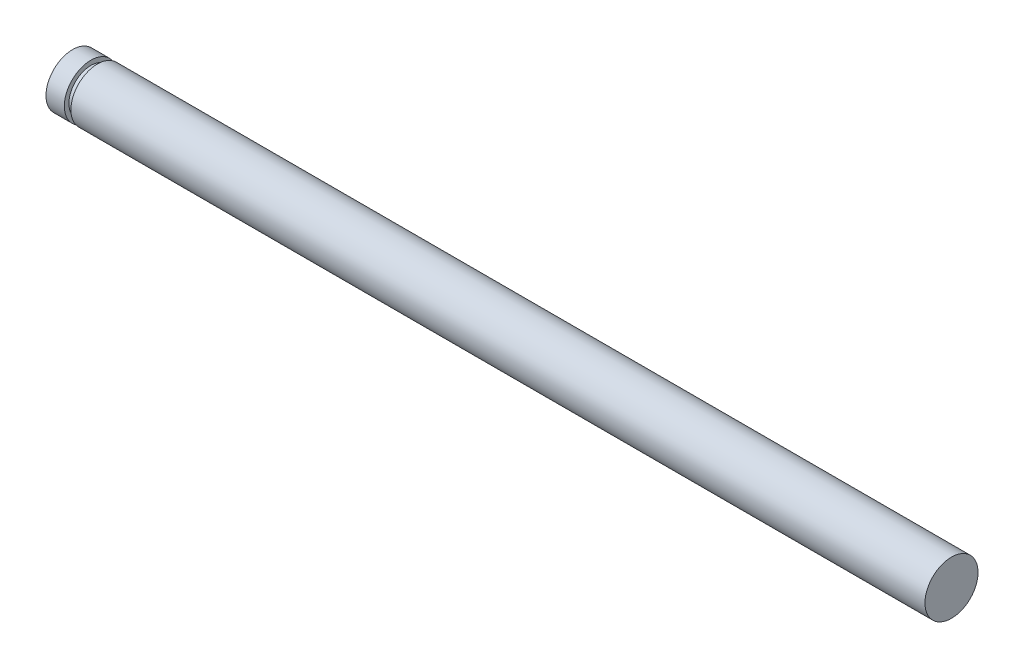
ISO-10303-21;
HEADER;
FILE_DESCRIPTION(('STEP AP214'),'2;1');
FILE_NAME('part.step','',(''),(''),'','','');
FILE_SCHEMA(('AUTOMOTIVE_DESIGN { 1 0 10303 214 1 1 1 1 }'));
ENDSEC;
DATA;
#1=APPLICATION_CONTEXT('core data for automotive mechanical design processes');
#2=APPLICATION_PROTOCOL_DEFINITION('international standard','automotive_design',2000,#1);
#3=PRODUCT_CONTEXT('',#1,'mechanical');
#4=PRODUCT('Part','Part','',(#3));
#5=PRODUCT_RELATED_PRODUCT_CATEGORY('part','',(#4));
#6=PRODUCT_DEFINITION_FORMATION('','',#4);
#7=PRODUCT_DEFINITION_CONTEXT('part definition',#1,'design');
#8=PRODUCT_DEFINITION('design','',#6,#7);
#9=PRODUCT_DEFINITION_SHAPE('','',#8);
#10=(LENGTH_UNIT() NAMED_UNIT(*) SI_UNIT(.MILLI.,.METRE.));
#11=(NAMED_UNIT(*) PLANE_ANGLE_UNIT() SI_UNIT($,.RADIAN.));
#12=(NAMED_UNIT(*) SI_UNIT($,.STERADIAN.) SOLID_ANGLE_UNIT());
#13=UNCERTAINTY_MEASURE_WITH_UNIT(LENGTH_MEASURE(1.E-05),#10,'distance_accuracy_value','');
#14=(GEOMETRIC_REPRESENTATION_CONTEXT(3) GLOBAL_UNCERTAINTY_ASSIGNED_CONTEXT((#13)) GLOBAL_UNIT_ASSIGNED_CONTEXT((#10,
#11,#12)) REPRESENTATION_CONTEXT('',''));
#15=CARTESIAN_POINT('',(0.,0.,0.));
#16=DIRECTION('',(0.,0.,1.));
#17=DIRECTION('',(1.,0.,0.));
#18=AXIS2_PLACEMENT_3D('',#15,#16,#17);
#19=CARTESIAN_POINT('',(-304.8,0.,0.));
#20=DIRECTION('',(1.,0.,0.));
#21=DIRECTION('',(0.,0.,-1.));
#22=AXIS2_PLACEMENT_3D('',#19,#20,#21);
#23=PLANE('',#22);
#24=CARTESIAN_POINT('',(-304.8,0.,0.));
#25=DIRECTION('',(-1.,0.,0.));
#26=DIRECTION('',(0.,0.,1.));
#27=AXIS2_PLACEMENT_3D('',#24,#25,#26);
#28=CIRCLE('',#27,18.415);
#29=CARTESIAN_POINT('',(-304.8,0.,18.415));
#30=VERTEX_POINT('',#29);
#31=EDGE_CURVE('E10',#30,#30,#28,.T.);
#32=ORIENTED_EDGE('',*,*,#31,.T.);
#33=EDGE_LOOP('',(#32));
#34=FACE_BOUND('',#33,.T.);
#35=ADVANCED_FACE('F35',(#34),#23,.F.);
#36=CARTESIAN_POINT('',(-304.8,0.,0.));
#37=DIRECTION('',(-1.,0.,0.));
#38=DIRECTION('',(0.,0.,1.));
#39=AXIS2_PLACEMENT_3D('',#36,#37,#38);
#40=CYLINDRICAL_SURFACE('',#39,18.415);
#41=ORIENTED_EDGE('',*,*,#31,.F.);
#42=EDGE_LOOP('',(#41));
#43=FACE_BOUND('',#42,.T.);
#44=CARTESIAN_POINT('',(-292.1,0.,0.));
#45=DIRECTION('',(-1.,0.,0.));
#46=DIRECTION('',(0.,0.,1.));
#47=AXIS2_PLACEMENT_3D('',#44,#45,#46);
#48=CIRCLE('',#47,18.415);
#49=CARTESIAN_POINT('',(-292.1,0.,18.415));
#50=VERTEX_POINT('',#49);
#51=EDGE_CURVE('E41',#50,#50,#48,.T.);
#52=ORIENTED_EDGE('',*,*,#51,.T.);
#53=EDGE_LOOP('',(#52));
#54=FACE_BOUND('',#53,.T.);
#55=ADVANCED_FACE('F73',(#43,#54),#40,.T.);
#56=CARTESIAN_POINT('',(-292.1,18.415,0.));
#57=DIRECTION('',(-1.,0.,0.));
#58=DIRECTION('',(0.,0.,1.));
#59=AXIS2_PLACEMENT_3D('',#56,#57,#58);
#60=PLANE('',#59);
#61=ORIENTED_EDGE('',*,*,#51,.F.);
#62=EDGE_LOOP('',(#61));
#63=FACE_BOUND('',#62,.T.);
#64=CARTESIAN_POINT('',(-292.1,0.,0.));
#65=DIRECTION('',(-1.,0.,0.));
#66=DIRECTION('',(0.,0.,1.));
#67=AXIS2_PLACEMENT_3D('',#64,#65,#66);
#68=CIRCLE('',#67,15.24);
#69=CARTESIAN_POINT('',(-292.1,0.,15.24));
#70=VERTEX_POINT('',#69);
#71=EDGE_CURVE('E45',#70,#70,#68,.T.);
#72=ORIENTED_EDGE('',*,*,#71,.T.);
#73=EDGE_LOOP('',(#72));
#74=FACE_BOUND('',#73,.T.);
#75=ADVANCED_FACE('F77',(#63,#74),#60,.F.);
#76=CARTESIAN_POINT('',(-304.8,0.,0.));
#77=DIRECTION('',(-1.,0.,0.));
#78=DIRECTION('',(0.,0.,1.));
#79=AXIS2_PLACEMENT_3D('',#76,#77,#78);
#80=CYLINDRICAL_SURFACE('',#79,15.24);
#81=ORIENTED_EDGE('',*,*,#71,.F.);
#82=EDGE_LOOP('',(#81));
#83=FACE_BOUND('',#82,.T.);
#84=CARTESIAN_POINT('',(-287.528,0.,0.));
#85=DIRECTION('',(-1.,0.,0.));
#86=DIRECTION('',(0.,0.,1.));
#87=AXIS2_PLACEMENT_3D('',#84,#85,#86);
#88=CIRCLE('',#87,15.24);
#89=CARTESIAN_POINT('',(-287.528,0.,15.24));
#90=VERTEX_POINT('',#89);
#91=EDGE_CURVE('E49',#90,#90,#88,.T.);
#92=ORIENTED_EDGE('',*,*,#91,.T.);
#93=EDGE_LOOP('',(#92));
#94=FACE_BOUND('',#93,.T.);
#95=ADVANCED_FACE('F82',(#83,#94),#80,.T.);
#96=CARTESIAN_POINT('',(-287.528,15.24,0.));
#97=DIRECTION('',(1.,0.,0.));
#98=DIRECTION('',(0.,0.,-1.));
#99=AXIS2_PLACEMENT_3D('',#96,#97,#98);
#100=PLANE('',#99);
#101=ORIENTED_EDGE('',*,*,#91,.F.);
#102=EDGE_LOOP('',(#101));
#103=FACE_BOUND('',#102,.T.);
#104=CARTESIAN_POINT('',(-287.528,0.,0.));
#105=DIRECTION('',(-1.,0.,0.));
#106=DIRECTION('',(0.,0.,1.));
#107=AXIS2_PLACEMENT_3D('',#104,#105,#106);
#108=CIRCLE('',#107,18.415);
#109=CARTESIAN_POINT('',(-287.528,0.,18.415));
#110=VERTEX_POINT('',#109);
#111=EDGE_CURVE('E54',#110,#110,#108,.T.);
#112=ORIENTED_EDGE('',*,*,#111,.T.);
#113=EDGE_LOOP('',(#112));
#114=FACE_BOUND('',#113,.T.);
#115=ADVANCED_FACE('F69',(#103,#114),#100,.F.);
#116=CARTESIAN_POINT('',(-304.8,0.,0.));
#117=DIRECTION('',(-1.,0.,0.));
#118=DIRECTION('',(0.,0.,1.));
#119=AXIS2_PLACEMENT_3D('',#116,#117,#118);
#120=CYLINDRICAL_SURFACE('',#119,18.415);
#121=ORIENTED_EDGE('',*,*,#111,.F.);
#122=EDGE_LOOP('',(#121));
#123=FACE_BOUND('',#122,.T.);
#124=CARTESIAN_POINT('',(304.8,0.,0.));
#125=DIRECTION('',(-1.,0.,0.));
#126=DIRECTION('',(0.,0.,1.));
#127=AXIS2_PLACEMENT_3D('',#124,#125,#126);
#128=CIRCLE('',#127,18.415);
#129=CARTESIAN_POINT('',(304.8,0.,18.415));
#130=VERTEX_POINT('',#129);
#131=EDGE_CURVE('E57',#130,#130,#128,.T.);
#132=ORIENTED_EDGE('',*,*,#131,.T.);
#133=EDGE_LOOP('',(#132));
#134=FACE_BOUND('',#133,.T.);
#135=ADVANCED_FACE('F61',(#123,#134),#120,.T.);
#136=CARTESIAN_POINT('',(304.8,18.415,0.));
#137=DIRECTION('',(-1.,0.,0.));
#138=DIRECTION('',(0.,0.,1.));
#139=AXIS2_PLACEMENT_3D('',#136,#137,#138);
#140=PLANE('',#139);
#141=ORIENTED_EDGE('',*,*,#131,.F.);
#142=EDGE_LOOP('',(#141));
#143=FACE_BOUND('',#142,.T.);
#144=ADVANCED_FACE('F63',(#143),#140,.F.);
#145=CLOSED_SHELL('',(#35,#55,#75,#95,#115,#135,#144));
#146=MANIFOLD_SOLID_BREP('B2',#145);
#147=ADVANCED_BREP_SHAPE_REPRESENTATION('',(#18,#146),#14);
#148=SHAPE_DEFINITION_REPRESENTATION(#9,#147);
ENDSEC;
END-ISO-10303-21;
